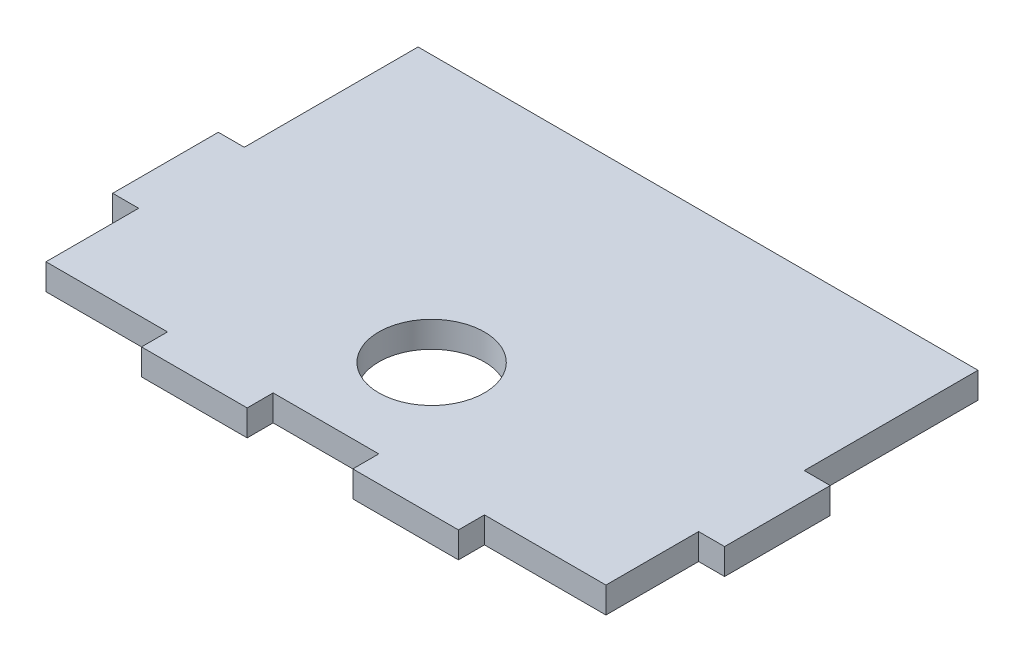
ISO-10303-21;
HEADER;
FILE_DESCRIPTION(('STEP AP214'),'2;1');
FILE_NAME('part.step','',(''),(''),'','','');
FILE_SCHEMA(('AUTOMOTIVE_DESIGN { 1 0 10303 214 1 1 1 1 }'));
ENDSEC;
DATA;
#1=APPLICATION_CONTEXT('core data for automotive mechanical design processes');
#2=APPLICATION_PROTOCOL_DEFINITION('international standard','automotive_design',2000,#1);
#3=PRODUCT_CONTEXT('',#1,'mechanical');
#4=PRODUCT('Part','Part','',(#3));
#5=PRODUCT_RELATED_PRODUCT_CATEGORY('part','',(#4));
#6=PRODUCT_DEFINITION_FORMATION('','',#4);
#7=PRODUCT_DEFINITION_CONTEXT('part definition',#1,'design');
#8=PRODUCT_DEFINITION('design','',#6,#7);
#9=PRODUCT_DEFINITION_SHAPE('','',#8);
#10=(LENGTH_UNIT() NAMED_UNIT(*) SI_UNIT(.MILLI.,.METRE.));
#11=(NAMED_UNIT(*) PLANE_ANGLE_UNIT() SI_UNIT($,.RADIAN.));
#12=(NAMED_UNIT(*) SI_UNIT($,.STERADIAN.) SOLID_ANGLE_UNIT());
#13=UNCERTAINTY_MEASURE_WITH_UNIT(LENGTH_MEASURE(1.E-05),#10,'distance_accuracy_value','');
#14=(GEOMETRIC_REPRESENTATION_CONTEXT(3) GLOBAL_UNCERTAINTY_ASSIGNED_CONTEXT((#13)) GLOBAL_UNIT_ASSIGNED_CONTEXT((#10,
#11,#12)) REPRESENTATION_CONTEXT('',''));
#15=CARTESIAN_POINT('',(0.,0.,0.));
#16=DIRECTION('',(0.,0.,1.));
#17=DIRECTION('',(1.,0.,0.));
#18=AXIS2_PLACEMENT_3D('',#15,#16,#17);
#19=CARTESIAN_POINT('',(0.,3.1242,0.));
#20=DIRECTION('',(0.,-1.,0.));
#21=DIRECTION('',(0.,0.,-1.));
#22=AXIS2_PLACEMENT_3D('',#19,#20,#21);
#23=PLANE('',#22);
#24=DIRECTION('',(0.,0.,-1.));
#25=VECTOR('',#24,1.);
#26=CARTESIAN_POINT('',(127.754742857143,3.1242,52.7558));
#27=LINE('',#26,#25);
#28=CARTESIAN_POINT('',(127.754742857143,3.1242,52.7558));
#29=VERTEX_POINT('',#28);
#30=CARTESIAN_POINT('',(127.754742857143,3.1242,49.6316));
#31=VERTEX_POINT('',#30);
#32=EDGE_CURVE('E241',#29,#31,#27,.T.);
#33=ORIENTED_EDGE('',*,*,#32,.T.);
#34=DIRECTION('',(1.,0.,0.));
#35=VECTOR('',#34,1.);
#36=CARTESIAN_POINT('',(127.754742857143,3.1242,49.6316));
#37=LINE('',#36,#35);
#38=CARTESIAN_POINT('',(140.454742857143,3.1242,49.6316));
#39=VERTEX_POINT('',#38);
#40=EDGE_CURVE('E129',#31,#39,#37,.T.);
#41=ORIENTED_EDGE('',*,*,#40,.T.);
#42=DIRECTION('',(0.,0.,1.));
#43=VECTOR('',#42,1.);
#44=CARTESIAN_POINT('',(140.454742857143,3.1242,49.6316));
#45=LINE('',#44,#43);
#46=CARTESIAN_POINT('',(140.454742857143,3.1242,52.7558));
#47=VERTEX_POINT('',#46);
#48=EDGE_CURVE('E292',#39,#47,#45,.T.);
#49=ORIENTED_EDGE('',*,*,#48,.T.);
#50=DIRECTION('',(1.,0.,0.));
#51=VECTOR('',#50,1.);
#52=CARTESIAN_POINT('',(140.454742857143,3.1242,52.7558));
#53=LINE('',#52,#51);
#54=CARTESIAN_POINT('',(153.154742857143,3.1242,52.7558));
#55=VERTEX_POINT('',#54);
#56=EDGE_CURVE('E311',#47,#55,#53,.T.);
#57=ORIENTED_EDGE('',*,*,#56,.T.);
#58=DIRECTION('',(0.,0.,-1.));
#59=VECTOR('',#58,1.);
#60=CARTESIAN_POINT('',(153.154742857143,3.1242,52.7558));
#61=LINE('',#60,#59);
#62=CARTESIAN_POINT('',(153.154742857143,3.1242,49.6316));
#63=VERTEX_POINT('',#62);
#64=EDGE_CURVE('E308',#55,#63,#61,.T.);
#65=ORIENTED_EDGE('',*,*,#64,.T.);
#66=DIRECTION('',(1.,0.,0.));
#67=VECTOR('',#66,1.);
#68=CARTESIAN_POINT('',(153.154742857143,3.1242,49.6316));
#69=LINE('',#68,#67);
#70=CARTESIAN_POINT('',(167.759742857143,3.1242,49.6316));
#71=VERTEX_POINT('',#70);
#72=EDGE_CURVE('E310',#63,#71,#69,.T.);
#73=ORIENTED_EDGE('',*,*,#72,.T.);
#74=DIRECTION('',(0.,0.,-1.));
#75=VECTOR('',#74,1.);
#76=CARTESIAN_POINT('',(167.759742857143,3.1242,49.6316));
#77=LINE('',#76,#75);
#78=CARTESIAN_POINT('',(167.759742857143,3.1242,38.4937));
#79=VERTEX_POINT('',#78);
#80=EDGE_CURVE('E313',#71,#79,#77,.T.);
#81=ORIENTED_EDGE('',*,*,#80,.T.);
#82=DIRECTION('',(1.,0.,0.));
#83=VECTOR('',#82,1.);
#84=CARTESIAN_POINT('',(167.759742857143,3.1242,38.4937));
#85=LINE('',#84,#83);
#86=CARTESIAN_POINT('',(170.883942857143,3.1242,38.4937));
#87=VERTEX_POINT('',#86);
#88=EDGE_CURVE('E319',#79,#87,#85,.T.);
#89=ORIENTED_EDGE('',*,*,#88,.T.);
#90=DIRECTION('',(0.,0.,-1.));
#91=VECTOR('',#90,1.);
#92=CARTESIAN_POINT('',(170.883942857143,3.1242,38.4937));
#93=LINE('',#92,#91);
#94=CARTESIAN_POINT('',(170.883942857143,3.1242,25.7937));
#95=VERTEX_POINT('',#94);
#96=EDGE_CURVE('E321',#87,#95,#93,.T.);
#97=ORIENTED_EDGE('',*,*,#96,.T.);
#98=DIRECTION('',(-1.,0.,0.));
#99=VECTOR('',#98,1.);
#100=CARTESIAN_POINT('',(170.883942857143,3.1242,25.7937));
#101=LINE('',#100,#99);
#102=CARTESIAN_POINT('',(167.759742857143,3.1242,25.7937));
#103=VERTEX_POINT('',#102);
#104=EDGE_CURVE('E323',#95,#103,#101,.T.);
#105=ORIENTED_EDGE('',*,*,#104,.T.);
#106=DIRECTION('',(0.,0.,-1.));
#107=VECTOR('',#106,1.);
#108=CARTESIAN_POINT('',(167.759742857143,3.1242,25.7937));
#109=LINE('',#108,#107);
#110=CARTESIAN_POINT('',(167.759742857143,3.1242,4.90713052192582));
#111=VERTEX_POINT('',#110);
#112=EDGE_CURVE('E325',#103,#111,#109,.T.);
#113=ORIENTED_EDGE('',*,*,#112,.T.);
#114=DIRECTION('',(-1.,0.,0.));
#115=VECTOR('',#114,1.);
#116=CARTESIAN_POINT('',(167.759742857143,3.1242,4.90713052192582));
#117=LINE('',#116,#115);
#118=CARTESIAN_POINT('',(100.449742857143,3.1242,4.90713052192583));
#119=VERTEX_POINT('',#118);
#120=EDGE_CURVE('E327',#111,#119,#117,.T.);
#121=ORIENTED_EDGE('',*,*,#120,.T.);
#122=DIRECTION('',(0.,0.,1.));
#123=VECTOR('',#122,1.);
#124=CARTESIAN_POINT('',(100.449742857143,3.1242,4.90713052192583));
#125=LINE('',#124,#123);
#126=CARTESIAN_POINT('',(100.449742857143,3.1242,25.7937));
#127=VERTEX_POINT('',#126);
#128=EDGE_CURVE('E329',#119,#127,#125,.T.);
#129=ORIENTED_EDGE('',*,*,#128,.T.);
#130=DIRECTION('',(-1.,0.,0.));
#131=VECTOR('',#130,1.);
#132=CARTESIAN_POINT('',(100.449742857143,3.1242,25.7937));
#133=LINE('',#132,#131);
#134=CARTESIAN_POINT('',(97.3255428571429,3.1242,25.7937));
#135=VERTEX_POINT('',#134);
#136=EDGE_CURVE('E331',#127,#135,#133,.T.);
#137=ORIENTED_EDGE('',*,*,#136,.T.);
#138=DIRECTION('',(0.,0.,1.));
#139=VECTOR('',#138,1.);
#140=CARTESIAN_POINT('',(97.3255428571429,3.1242,25.7937));
#141=LINE('',#140,#139);
#142=CARTESIAN_POINT('',(97.3255428571429,3.1242,38.4937));
#143=VERTEX_POINT('',#142);
#144=EDGE_CURVE('E333',#135,#143,#141,.T.);
#145=ORIENTED_EDGE('',*,*,#144,.T.);
#146=DIRECTION('',(1.,0.,0.));
#147=VECTOR('',#146,1.);
#148=CARTESIAN_POINT('',(97.3255428571429,3.1242,38.4937));
#149=LINE('',#148,#147);
#150=CARTESIAN_POINT('',(100.449742857143,3.1242,38.4937));
#151=VERTEX_POINT('',#150);
#152=EDGE_CURVE('E335',#143,#151,#149,.T.);
#153=ORIENTED_EDGE('',*,*,#152,.T.);
#154=DIRECTION('',(0.,0.,1.));
#155=VECTOR('',#154,1.);
#156=CARTESIAN_POINT('',(100.449742857143,3.1242,38.4937));
#157=LINE('',#156,#155);
#158=CARTESIAN_POINT('',(100.449742857143,3.1242,49.6316));
#159=VERTEX_POINT('',#158);
#160=EDGE_CURVE('E184',#151,#159,#157,.T.);
#161=ORIENTED_EDGE('',*,*,#160,.T.);
#162=DIRECTION('',(1.,0.,0.));
#163=VECTOR('',#162,1.);
#164=CARTESIAN_POINT('',(100.449742857143,3.1242,49.6316));
#165=LINE('',#164,#163);
#166=CARTESIAN_POINT('',(115.054742857143,3.1242,49.6316));
#167=VERTEX_POINT('',#166);
#168=EDGE_CURVE('E178',#159,#167,#165,.T.);
#169=ORIENTED_EDGE('',*,*,#168,.T.);
#170=DIRECTION('',(0.,0.,1.));
#171=VECTOR('',#170,1.);
#172=CARTESIAN_POINT('',(115.054742857143,3.1242,49.6316));
#173=LINE('',#172,#171);
#174=CARTESIAN_POINT('',(115.054742857143,3.1242,52.7558));
#175=VERTEX_POINT('',#174);
#176=EDGE_CURVE('E182',#167,#175,#173,.T.);
#177=ORIENTED_EDGE('',*,*,#176,.T.);
#178=DIRECTION('',(1.,0.,0.));
#179=VECTOR('',#178,1.);
#180=CARTESIAN_POINT('',(115.054742857143,3.1242,52.7558));
#181=LINE('',#180,#179);
#182=EDGE_CURVE('E50',#175,#29,#181,.T.);
#183=ORIENTED_EDGE('',*,*,#182,.T.);
#184=EDGE_LOOP('',(#33,#41,#49,#57,#65,#73,#81,#89,#97,#105,#113,#121,#129,#137,#145,#153,#161,
#169,#177,#183));
#185=FACE_BOUND('',#184,.T.);
#186=CARTESIAN_POINT('',(134.104742857143,3.1242,36.9316));
#187=DIRECTION('',(0.,1.,0.));
#188=DIRECTION('',(0.,0.,1.));
#189=AXIS2_PLACEMENT_3D('',#186,#187,#188);
#190=CIRCLE('',#189,6.35);
#191=CARTESIAN_POINT('',(134.104742857143,3.1242,43.2816));
#192=VERTEX_POINT('',#191);
#193=EDGE_CURVE('E206',#192,#192,#190,.T.);
#194=ORIENTED_EDGE('',*,*,#193,.F.);
#195=EDGE_LOOP('',(#194));
#196=FACE_BOUND('',#195,.T.);
#197=ADVANCED_FACE('F33',(#185,#196),#23,.F.);
#198=CARTESIAN_POINT('',(0.,0.,0.));
#199=DIRECTION('',(0.,-1.,0.));
#200=DIRECTION('',(0.,0.,-1.));
#201=AXIS2_PLACEMENT_3D('',#198,#199,#200);
#202=PLANE('',#201);
#203=DIRECTION('',(0.,0.,-1.));
#204=VECTOR('',#203,1.);
#205=CARTESIAN_POINT('',(127.754742857143,0.,52.7558));
#206=LINE('',#205,#204);
#207=CARTESIAN_POINT('',(127.754742857143,0.,52.7558));
#208=VERTEX_POINT('',#207);
#209=CARTESIAN_POINT('',(127.754742857143,0.,49.6316));
#210=VERTEX_POINT('',#209);
#211=EDGE_CURVE('E202',#208,#210,#206,.T.);
#212=ORIENTED_EDGE('',*,*,#211,.F.);
#213=DIRECTION('',(1.,0.,0.));
#214=VECTOR('',#213,1.);
#215=CARTESIAN_POINT('',(115.054742857143,0.,52.7558));
#216=LINE('',#215,#214);
#217=CARTESIAN_POINT('',(115.054742857143,0.,52.7558));
#218=VERTEX_POINT('',#217);
#219=EDGE_CURVE('E121',#218,#208,#216,.T.);
#220=ORIENTED_EDGE('',*,*,#219,.F.);
#221=DIRECTION('',(0.,0.,1.));
#222=VECTOR('',#221,1.);
#223=CARTESIAN_POINT('',(115.054742857143,0.,49.6316));
#224=LINE('',#223,#222);
#225=CARTESIAN_POINT('',(115.054742857143,0.,49.6316));
#226=VERTEX_POINT('',#225);
#227=EDGE_CURVE('E115',#226,#218,#224,.T.);
#228=ORIENTED_EDGE('',*,*,#227,.F.);
#229=DIRECTION('',(1.,0.,0.));
#230=VECTOR('',#229,1.);
#231=CARTESIAN_POINT('',(100.449742857143,0.,49.6316));
#232=LINE('',#231,#230);
#233=CARTESIAN_POINT('',(100.449742857143,0.,49.6316));
#234=VERTEX_POINT('',#233);
#235=EDGE_CURVE('E192',#234,#226,#232,.T.);
#236=ORIENTED_EDGE('',*,*,#235,.F.);
#237=DIRECTION('',(0.,0.,1.));
#238=VECTOR('',#237,1.);
#239=CARTESIAN_POINT('',(100.449742857143,0.,38.4937));
#240=LINE('',#239,#238);
#241=CARTESIAN_POINT('',(100.449742857143,0.,38.4937));
#242=VERTEX_POINT('',#241);
#243=EDGE_CURVE('E236',#242,#234,#240,.T.);
#244=ORIENTED_EDGE('',*,*,#243,.F.);
#245=DIRECTION('',(1.,0.,0.));
#246=VECTOR('',#245,1.);
#247=CARTESIAN_POINT('',(97.3255428571429,0.,38.4937));
#248=LINE('',#247,#246);
#249=CARTESIAN_POINT('',(97.3255428571429,0.,38.4937));
#250=VERTEX_POINT('',#249);
#251=EDGE_CURVE('E234',#250,#242,#248,.T.);
#252=ORIENTED_EDGE('',*,*,#251,.F.);
#253=DIRECTION('',(0.,0.,1.));
#254=VECTOR('',#253,1.);
#255=CARTESIAN_POINT('',(97.3255428571429,0.,25.7937));
#256=LINE('',#255,#254);
#257=CARTESIAN_POINT('',(97.3255428571429,0.,25.7937));
#258=VERTEX_POINT('',#257);
#259=EDGE_CURVE('E232',#258,#250,#256,.T.);
#260=ORIENTED_EDGE('',*,*,#259,.F.);
#261=DIRECTION('',(-1.,0.,0.));
#262=VECTOR('',#261,1.);
#263=CARTESIAN_POINT('',(100.449742857143,0.,25.7937));
#264=LINE('',#263,#262);
#265=CARTESIAN_POINT('',(100.449742857143,0.,25.7937));
#266=VERTEX_POINT('',#265);
#267=EDGE_CURVE('E230',#266,#258,#264,.T.);
#268=ORIENTED_EDGE('',*,*,#267,.F.);
#269=DIRECTION('',(0.,0.,1.));
#270=VECTOR('',#269,1.);
#271=CARTESIAN_POINT('',(100.449742857143,0.,4.90713052192583));
#272=LINE('',#271,#270);
#273=CARTESIAN_POINT('',(100.449742857143,0.,4.90713052192583));
#274=VERTEX_POINT('',#273);
#275=EDGE_CURVE('E228',#274,#266,#272,.T.);
#276=ORIENTED_EDGE('',*,*,#275,.F.);
#277=DIRECTION('',(-1.,0.,0.));
#278=VECTOR('',#277,1.);
#279=CARTESIAN_POINT('',(167.759742857143,0.,4.90713052192582));
#280=LINE('',#279,#278);
#281=CARTESIAN_POINT('',(167.759742857143,0.,4.90713052192582));
#282=VERTEX_POINT('',#281);
#283=EDGE_CURVE('E226',#282,#274,#280,.T.);
#284=ORIENTED_EDGE('',*,*,#283,.F.);
#285=DIRECTION('',(0.,0.,-1.));
#286=VECTOR('',#285,1.);
#287=CARTESIAN_POINT('',(167.759742857143,0.,25.7937));
#288=LINE('',#287,#286);
#289=CARTESIAN_POINT('',(167.759742857143,0.,25.7937));
#290=VERTEX_POINT('',#289);
#291=EDGE_CURVE('E224',#290,#282,#288,.T.);
#292=ORIENTED_EDGE('',*,*,#291,.F.);
#293=DIRECTION('',(-1.,0.,0.));
#294=VECTOR('',#293,1.);
#295=CARTESIAN_POINT('',(170.883942857143,0.,25.7937));
#296=LINE('',#295,#294);
#297=CARTESIAN_POINT('',(170.883942857143,0.,25.7937));
#298=VERTEX_POINT('',#297);
#299=EDGE_CURVE('E222',#298,#290,#296,.T.);
#300=ORIENTED_EDGE('',*,*,#299,.F.);
#301=DIRECTION('',(0.,0.,-1.));
#302=VECTOR('',#301,1.);
#303=CARTESIAN_POINT('',(170.883942857143,0.,38.4937));
#304=LINE('',#303,#302);
#305=CARTESIAN_POINT('',(170.883942857143,0.,38.4937));
#306=VERTEX_POINT('',#305);
#307=EDGE_CURVE('E220',#306,#298,#304,.T.);
#308=ORIENTED_EDGE('',*,*,#307,.F.);
#309=DIRECTION('',(1.,0.,0.));
#310=VECTOR('',#309,1.);
#311=CARTESIAN_POINT('',(167.759742857143,0.,38.4937));
#312=LINE('',#311,#310);
#313=CARTESIAN_POINT('',(167.759742857143,0.,38.4937));
#314=VERTEX_POINT('',#313);
#315=EDGE_CURVE('E218',#314,#306,#312,.T.);
#316=ORIENTED_EDGE('',*,*,#315,.F.);
#317=DIRECTION('',(0.,0.,-1.));
#318=VECTOR('',#317,1.);
#319=CARTESIAN_POINT('',(167.759742857143,0.,49.6316));
#320=LINE('',#319,#318);
#321=CARTESIAN_POINT('',(167.759742857143,0.,49.6316));
#322=VERTEX_POINT('',#321);
#323=EDGE_CURVE('E216',#322,#314,#320,.T.);
#324=ORIENTED_EDGE('',*,*,#323,.F.);
#325=DIRECTION('',(1.,0.,0.));
#326=VECTOR('',#325,1.);
#327=CARTESIAN_POINT('',(153.154742857143,0.,49.6316));
#328=LINE('',#327,#326);
#329=CARTESIAN_POINT('',(153.154742857143,0.,49.6316));
#330=VERTEX_POINT('',#329);
#331=EDGE_CURVE('E214',#330,#322,#328,.T.);
#332=ORIENTED_EDGE('',*,*,#331,.F.);
#333=DIRECTION('',(0.,0.,-1.));
#334=VECTOR('',#333,1.);
#335=CARTESIAN_POINT('',(153.154742857143,0.,52.7558));
#336=LINE('',#335,#334);
#337=CARTESIAN_POINT('',(153.154742857143,0.,52.7558));
#338=VERTEX_POINT('',#337);
#339=EDGE_CURVE('E212',#338,#330,#336,.T.);
#340=ORIENTED_EDGE('',*,*,#339,.F.);
#341=DIRECTION('',(1.,0.,0.));
#342=VECTOR('',#341,1.);
#343=CARTESIAN_POINT('',(140.454742857143,0.,52.7558));
#344=LINE('',#343,#342);
#345=CARTESIAN_POINT('',(140.454742857143,0.,52.7558));
#346=VERTEX_POINT('',#345);
#347=EDGE_CURVE('E210',#346,#338,#344,.T.);
#348=ORIENTED_EDGE('',*,*,#347,.F.);
#349=DIRECTION('',(0.,0.,1.));
#350=VECTOR('',#349,1.);
#351=CARTESIAN_POINT('',(140.454742857143,0.,49.6316));
#352=LINE('',#351,#350);
#353=CARTESIAN_POINT('',(140.454742857143,0.,49.6316));
#354=VERTEX_POINT('',#353);
#355=EDGE_CURVE('E208',#354,#346,#352,.T.);
#356=ORIENTED_EDGE('',*,*,#355,.F.);
#357=DIRECTION('',(1.,0.,0.));
#358=VECTOR('',#357,1.);
#359=CARTESIAN_POINT('',(127.754742857143,0.,49.6316));
#360=LINE('',#359,#358);
#361=EDGE_CURVE('E205',#210,#354,#360,.T.);
#362=ORIENTED_EDGE('',*,*,#361,.F.);
#363=EDGE_LOOP('',(#212,#220,#228,#236,#244,#252,#260,#268,#276,#284,#292,#300,#308,#316,#324,
#332,#340,#348,#356,#362));
#364=FACE_BOUND('',#363,.T.);
#365=CARTESIAN_POINT('',(134.104742857143,0.,36.9316));
#366=DIRECTION('',(0.,1.,0.));
#367=DIRECTION('',(0.,0.,1.));
#368=AXIS2_PLACEMENT_3D('',#365,#366,#367);
#369=CIRCLE('',#368,6.35);
#370=CARTESIAN_POINT('',(134.104742857143,0.,43.2816));
#371=VERTEX_POINT('',#370);
#372=EDGE_CURVE('E586',#371,#371,#369,.T.);
#373=ORIENTED_EDGE('',*,*,#372,.T.);
#374=EDGE_LOOP('',(#373));
#375=FACE_BOUND('',#374,.T.);
#376=ADVANCED_FACE('F296',(#364,#375),#202,.T.);
#377=CARTESIAN_POINT('',(127.754742857143,3.1242,52.7558));
#378=DIRECTION('',(-1.,0.,0.));
#379=DIRECTION('',(0.,0.,1.));
#380=AXIS2_PLACEMENT_3D('',#377,#378,#379);
#381=PLANE('',#380);
#382=ORIENTED_EDGE('',*,*,#211,.T.);
#383=DIRECTION('',(0.,-1.,0.));
#384=VECTOR('',#383,1.);
#385=CARTESIAN_POINT('',(127.754742857143,3.1242,49.6316));
#386=LINE('',#385,#384);
#387=EDGE_CURVE('E11',#31,#210,#386,.T.);
#388=ORIENTED_EDGE('',*,*,#387,.F.);
#389=ORIENTED_EDGE('',*,*,#32,.F.);
#390=DIRECTION('',(0.,-1.,0.));
#391=VECTOR('',#390,1.);
#392=CARTESIAN_POINT('',(127.754742857143,3.1242,52.7558));
#393=LINE('',#392,#391);
#394=EDGE_CURVE('E198',#29,#208,#393,.T.);
#395=ORIENTED_EDGE('',*,*,#394,.T.);
#396=EDGE_LOOP('',(#382,#388,#389,#395));
#397=FACE_BOUND('',#396,.T.);
#398=ADVANCED_FACE('F35',(#397),#381,.F.);
#399=CARTESIAN_POINT('',(127.754742857143,3.1242,49.6316));
#400=DIRECTION('',(0.,0.,-1.));
#401=DIRECTION('',(-1.,0.,0.));
#402=AXIS2_PLACEMENT_3D('',#399,#400,#401);
#403=PLANE('',#402);
#404=ORIENTED_EDGE('',*,*,#361,.T.);
#405=DIRECTION('',(0.,-1.,0.));
#406=VECTOR('',#405,1.);
#407=CARTESIAN_POINT('',(140.454742857143,3.1242,49.6316));
#408=LINE('',#407,#406);
#409=EDGE_CURVE('E42',#39,#354,#408,.T.);
#410=ORIENTED_EDGE('',*,*,#409,.F.);
#411=ORIENTED_EDGE('',*,*,#40,.F.);
#412=ORIENTED_EDGE('',*,*,#387,.T.);
#413=EDGE_LOOP('',(#404,#410,#411,#412));
#414=FACE_BOUND('',#413,.T.);
#415=ADVANCED_FACE('F369',(#414),#403,.F.);
#416=CARTESIAN_POINT('',(140.454742857143,3.1242,49.6316));
#417=DIRECTION('',(1.,0.,0.));
#418=DIRECTION('',(0.,0.,-1.));
#419=AXIS2_PLACEMENT_3D('',#416,#417,#418);
#420=PLANE('',#419);
#421=ORIENTED_EDGE('',*,*,#355,.T.);
#422=DIRECTION('',(0.,-1.,0.));
#423=VECTOR('',#422,1.);
#424=CARTESIAN_POINT('',(140.454742857143,3.1242,52.7558));
#425=LINE('',#424,#423);
#426=EDGE_CURVE('E284',#47,#346,#425,.T.);
#427=ORIENTED_EDGE('',*,*,#426,.F.);
#428=ORIENTED_EDGE('',*,*,#48,.F.);
#429=ORIENTED_EDGE('',*,*,#409,.T.);
#430=EDGE_LOOP('',(#421,#427,#428,#429));
#431=FACE_BOUND('',#430,.T.);
#432=ADVANCED_FACE('F290',(#431),#420,.F.);
#433=CARTESIAN_POINT('',(140.454742857143,3.1242,52.7558));
#434=DIRECTION('',(0.,0.,-1.));
#435=DIRECTION('',(-1.,0.,0.));
#436=AXIS2_PLACEMENT_3D('',#433,#434,#435);
#437=PLANE('',#436);
#438=ORIENTED_EDGE('',*,*,#347,.T.);
#439=DIRECTION('',(0.,-1.,0.));
#440=VECTOR('',#439,1.);
#441=CARTESIAN_POINT('',(153.154742857143,3.1242,52.7558));
#442=LINE('',#441,#440);
#443=EDGE_CURVE('E281',#55,#338,#442,.T.);
#444=ORIENTED_EDGE('',*,*,#443,.F.);
#445=ORIENTED_EDGE('',*,*,#56,.F.);
#446=ORIENTED_EDGE('',*,*,#426,.T.);
#447=EDGE_LOOP('',(#438,#444,#445,#446));
#448=FACE_BOUND('',#447,.T.);
#449=ADVANCED_FACE('F302',(#448),#437,.F.);
#450=CARTESIAN_POINT('',(153.154742857143,3.1242,52.7558));
#451=DIRECTION('',(-1.,0.,0.));
#452=DIRECTION('',(0.,0.,1.));
#453=AXIS2_PLACEMENT_3D('',#450,#451,#452);
#454=PLANE('',#453);
#455=ORIENTED_EDGE('',*,*,#339,.T.);
#456=DIRECTION('',(0.,-1.,0.));
#457=VECTOR('',#456,1.);
#458=CARTESIAN_POINT('',(153.154742857143,3.1242,49.6316));
#459=LINE('',#458,#457);
#460=EDGE_CURVE('E278',#63,#330,#459,.T.);
#461=ORIENTED_EDGE('',*,*,#460,.F.);
#462=ORIENTED_EDGE('',*,*,#64,.F.);
#463=ORIENTED_EDGE('',*,*,#443,.T.);
#464=EDGE_LOOP('',(#455,#461,#462,#463));
#465=FACE_BOUND('',#464,.T.);
#466=ADVANCED_FACE('F306',(#465),#454,.F.);
#467=CARTESIAN_POINT('',(153.154742857143,3.1242,49.6316));
#468=DIRECTION('',(0.,0.,-1.));
#469=DIRECTION('',(-1.,0.,0.));
#470=AXIS2_PLACEMENT_3D('',#467,#468,#469);
#471=PLANE('',#470);
#472=ORIENTED_EDGE('',*,*,#331,.T.);
#473=DIRECTION('',(0.,-1.,0.));
#474=VECTOR('',#473,1.);
#475=CARTESIAN_POINT('',(167.759742857143,3.1242,49.6316));
#476=LINE('',#475,#474);
#477=EDGE_CURVE('E275',#71,#322,#476,.T.);
#478=ORIENTED_EDGE('',*,*,#477,.F.);
#479=ORIENTED_EDGE('',*,*,#72,.F.);
#480=ORIENTED_EDGE('',*,*,#460,.T.);
#481=EDGE_LOOP('',(#472,#478,#479,#480));
#482=FACE_BOUND('',#481,.T.);
#483=ADVANCED_FACE('F382',(#482),#471,.F.);
#484=CARTESIAN_POINT('',(167.759742857143,3.1242,49.6316));
#485=DIRECTION('',(-1.,0.,0.));
#486=DIRECTION('',(0.,0.,1.));
#487=AXIS2_PLACEMENT_3D('',#484,#485,#486);
#488=PLANE('',#487);
#489=ORIENTED_EDGE('',*,*,#323,.T.);
#490=DIRECTION('',(0.,-1.,0.));
#491=VECTOR('',#490,1.);
#492=CARTESIAN_POINT('',(167.759742857143,3.1242,38.4937));
#493=LINE('',#492,#491);
#494=EDGE_CURVE('E272',#79,#314,#493,.T.);
#495=ORIENTED_EDGE('',*,*,#494,.F.);
#496=ORIENTED_EDGE('',*,*,#80,.F.);
#497=ORIENTED_EDGE('',*,*,#477,.T.);
#498=EDGE_LOOP('',(#489,#495,#496,#497));
#499=FACE_BOUND('',#498,.T.);
#500=ADVANCED_FACE('F385',(#499),#488,.F.);
#501=CARTESIAN_POINT('',(167.759742857143,3.1242,38.4937));
#502=DIRECTION('',(0.,0.,-1.));
#503=DIRECTION('',(-1.,0.,0.));
#504=AXIS2_PLACEMENT_3D('',#501,#502,#503);
#505=PLANE('',#504);
#506=ORIENTED_EDGE('',*,*,#315,.T.);
#507=DIRECTION('',(0.,-1.,0.));
#508=VECTOR('',#507,1.);
#509=CARTESIAN_POINT('',(170.883942857143,3.1242,38.4937));
#510=LINE('',#509,#508);
#511=EDGE_CURVE('E269',#87,#306,#510,.T.);
#512=ORIENTED_EDGE('',*,*,#511,.F.);
#513=ORIENTED_EDGE('',*,*,#88,.F.);
#514=ORIENTED_EDGE('',*,*,#494,.T.);
#515=EDGE_LOOP('',(#506,#512,#513,#514));
#516=FACE_BOUND('',#515,.T.);
#517=ADVANCED_FACE('F389',(#516),#505,.F.);
#518=CARTESIAN_POINT('',(170.883942857143,3.1242,38.4937));
#519=DIRECTION('',(-1.,0.,0.));
#520=DIRECTION('',(0.,0.,1.));
#521=AXIS2_PLACEMENT_3D('',#518,#519,#520);
#522=PLANE('',#521);
#523=ORIENTED_EDGE('',*,*,#307,.T.);
#524=DIRECTION('',(0.,-1.,0.));
#525=VECTOR('',#524,1.);
#526=CARTESIAN_POINT('',(170.883942857143,3.1242,25.7937));
#527=LINE('',#526,#525);
#528=EDGE_CURVE('E266',#95,#298,#527,.T.);
#529=ORIENTED_EDGE('',*,*,#528,.F.);
#530=ORIENTED_EDGE('',*,*,#96,.F.);
#531=ORIENTED_EDGE('',*,*,#511,.T.);
#532=EDGE_LOOP('',(#523,#529,#530,#531));
#533=FACE_BOUND('',#532,.T.);
#534=ADVANCED_FACE('F393',(#533),#522,.F.);
#535=CARTESIAN_POINT('',(170.883942857143,3.1242,25.7937));
#536=DIRECTION('',(0.,0.,1.));
#537=DIRECTION('',(1.,0.,0.));
#538=AXIS2_PLACEMENT_3D('',#535,#536,#537);
#539=PLANE('',#538);
#540=ORIENTED_EDGE('',*,*,#299,.T.);
#541=DIRECTION('',(0.,-1.,0.));
#542=VECTOR('',#541,1.);
#543=CARTESIAN_POINT('',(167.759742857143,3.1242,25.7937));
#544=LINE('',#543,#542);
#545=EDGE_CURVE('E263',#103,#290,#544,.T.);
#546=ORIENTED_EDGE('',*,*,#545,.F.);
#547=ORIENTED_EDGE('',*,*,#104,.F.);
#548=ORIENTED_EDGE('',*,*,#528,.T.);
#549=EDGE_LOOP('',(#540,#546,#547,#548));
#550=FACE_BOUND('',#549,.T.);
#551=ADVANCED_FACE('F397',(#550),#539,.F.);
#552=CARTESIAN_POINT('',(167.759742857143,3.1242,25.7937));
#553=DIRECTION('',(-1.,0.,0.));
#554=DIRECTION('',(0.,0.,1.));
#555=AXIS2_PLACEMENT_3D('',#552,#553,#554);
#556=PLANE('',#555);
#557=ORIENTED_EDGE('',*,*,#291,.T.);
#558=DIRECTION('',(0.,-1.,0.));
#559=VECTOR('',#558,1.);
#560=CARTESIAN_POINT('',(167.759742857143,3.1242,4.90713052192582));
#561=LINE('',#560,#559);
#562=EDGE_CURVE('E260',#111,#282,#561,.T.);
#563=ORIENTED_EDGE('',*,*,#562,.F.);
#564=ORIENTED_EDGE('',*,*,#112,.F.);
#565=ORIENTED_EDGE('',*,*,#545,.T.);
#566=EDGE_LOOP('',(#557,#563,#564,#565));
#567=FACE_BOUND('',#566,.T.);
#568=ADVANCED_FACE('F401',(#567),#556,.F.);
#569=CARTESIAN_POINT('',(167.759742857143,3.1242,4.90713052192582));
#570=DIRECTION('',(0.,0.,1.));
#571=DIRECTION('',(1.,0.,0.));
#572=AXIS2_PLACEMENT_3D('',#569,#570,#571);
#573=PLANE('',#572);
#574=ORIENTED_EDGE('',*,*,#283,.T.);
#575=DIRECTION('',(0.,-1.,0.));
#576=VECTOR('',#575,1.);
#577=CARTESIAN_POINT('',(100.449742857143,3.1242,4.90713052192583));
#578=LINE('',#577,#576);
#579=EDGE_CURVE('E257',#119,#274,#578,.T.);
#580=ORIENTED_EDGE('',*,*,#579,.F.);
#581=ORIENTED_EDGE('',*,*,#120,.F.);
#582=ORIENTED_EDGE('',*,*,#562,.T.);
#583=EDGE_LOOP('',(#574,#580,#581,#582));
#584=FACE_BOUND('',#583,.T.);
#585=ADVANCED_FACE('F405',(#584),#573,.F.);
#586=CARTESIAN_POINT('',(100.449742857143,3.1242,4.90713052192583));
#587=DIRECTION('',(1.,0.,0.));
#588=DIRECTION('',(0.,0.,-1.));
#589=AXIS2_PLACEMENT_3D('',#586,#587,#588);
#590=PLANE('',#589);
#591=ORIENTED_EDGE('',*,*,#275,.T.);
#592=DIRECTION('',(0.,-1.,0.));
#593=VECTOR('',#592,1.);
#594=CARTESIAN_POINT('',(100.449742857143,3.1242,25.7937));
#595=LINE('',#594,#593);
#596=EDGE_CURVE('E254',#127,#266,#595,.T.);
#597=ORIENTED_EDGE('',*,*,#596,.F.);
#598=ORIENTED_EDGE('',*,*,#128,.F.);
#599=ORIENTED_EDGE('',*,*,#579,.T.);
#600=EDGE_LOOP('',(#591,#597,#598,#599));
#601=FACE_BOUND('',#600,.T.);
#602=ADVANCED_FACE('F409',(#601),#590,.F.);
#603=CARTESIAN_POINT('',(100.449742857143,3.1242,25.7937));
#604=DIRECTION('',(0.,0.,1.));
#605=DIRECTION('',(1.,0.,0.));
#606=AXIS2_PLACEMENT_3D('',#603,#604,#605);
#607=PLANE('',#606);
#608=ORIENTED_EDGE('',*,*,#267,.T.);
#609=DIRECTION('',(0.,-1.,0.));
#610=VECTOR('',#609,1.);
#611=CARTESIAN_POINT('',(97.3255428571429,3.1242,25.7937));
#612=LINE('',#611,#610);
#613=EDGE_CURVE('E251',#135,#258,#612,.T.);
#614=ORIENTED_EDGE('',*,*,#613,.F.);
#615=ORIENTED_EDGE('',*,*,#136,.F.);
#616=ORIENTED_EDGE('',*,*,#596,.T.);
#617=EDGE_LOOP('',(#608,#614,#615,#616));
#618=FACE_BOUND('',#617,.T.);
#619=ADVANCED_FACE('F413',(#618),#607,.F.);
#620=CARTESIAN_POINT('',(97.3255428571429,3.1242,25.7937));
#621=DIRECTION('',(1.,0.,0.));
#622=DIRECTION('',(0.,0.,-1.));
#623=AXIS2_PLACEMENT_3D('',#620,#621,#622);
#624=PLANE('',#623);
#625=ORIENTED_EDGE('',*,*,#259,.T.);
#626=DIRECTION('',(0.,-1.,0.));
#627=VECTOR('',#626,1.);
#628=CARTESIAN_POINT('',(97.3255428571429,3.1242,38.4937));
#629=LINE('',#628,#627);
#630=EDGE_CURVE('E248',#143,#250,#629,.T.);
#631=ORIENTED_EDGE('',*,*,#630,.F.);
#632=ORIENTED_EDGE('',*,*,#144,.F.);
#633=ORIENTED_EDGE('',*,*,#613,.T.);
#634=EDGE_LOOP('',(#625,#631,#632,#633));
#635=FACE_BOUND('',#634,.T.);
#636=ADVANCED_FACE('F417',(#635),#624,.F.);
#637=CARTESIAN_POINT('',(97.3255428571429,3.1242,38.4937));
#638=DIRECTION('',(0.,0.,-1.));
#639=DIRECTION('',(-1.,0.,0.));
#640=AXIS2_PLACEMENT_3D('',#637,#638,#639);
#641=PLANE('',#640);
#642=ORIENTED_EDGE('',*,*,#251,.T.);
#643=DIRECTION('',(0.,-1.,0.));
#644=VECTOR('',#643,1.);
#645=CARTESIAN_POINT('',(100.449742857143,3.1242,38.4937));
#646=LINE('',#645,#644);
#647=EDGE_CURVE('E245',#151,#242,#646,.T.);
#648=ORIENTED_EDGE('',*,*,#647,.F.);
#649=ORIENTED_EDGE('',*,*,#152,.F.);
#650=ORIENTED_EDGE('',*,*,#630,.T.);
#651=EDGE_LOOP('',(#642,#648,#649,#650));
#652=FACE_BOUND('',#651,.T.);
#653=ADVANCED_FACE('F341',(#652),#641,.F.);
#654=CARTESIAN_POINT('',(100.449742857143,3.1242,38.4937));
#655=DIRECTION('',(1.,0.,0.));
#656=DIRECTION('',(0.,0.,-1.));
#657=AXIS2_PLACEMENT_3D('',#654,#655,#656);
#658=PLANE('',#657);
#659=ORIENTED_EDGE('',*,*,#243,.T.);
#660=DIRECTION('',(0.,-1.,0.));
#661=VECTOR('',#660,1.);
#662=CARTESIAN_POINT('',(100.449742857143,3.1242,49.6316));
#663=LINE('',#662,#661);
#664=EDGE_CURVE('E193',#159,#234,#663,.T.);
#665=ORIENTED_EDGE('',*,*,#664,.F.);
#666=ORIENTED_EDGE('',*,*,#160,.F.);
#667=ORIENTED_EDGE('',*,*,#647,.T.);
#668=EDGE_LOOP('',(#659,#665,#666,#667));
#669=FACE_BOUND('',#668,.T.);
#670=ADVANCED_FACE('F345',(#669),#658,.F.);
#671=CARTESIAN_POINT('',(100.449742857143,3.1242,49.6316));
#672=DIRECTION('',(0.,0.,-1.));
#673=DIRECTION('',(-1.,0.,0.));
#674=AXIS2_PLACEMENT_3D('',#671,#672,#673);
#675=PLANE('',#674);
#676=ORIENTED_EDGE('',*,*,#235,.T.);
#677=DIRECTION('',(0.,-1.,0.));
#678=VECTOR('',#677,1.);
#679=CARTESIAN_POINT('',(115.054742857143,3.1242,49.6316));
#680=LINE('',#679,#678);
#681=EDGE_CURVE('E189',#167,#226,#680,.T.);
#682=ORIENTED_EDGE('',*,*,#681,.F.);
#683=ORIENTED_EDGE('',*,*,#168,.F.);
#684=ORIENTED_EDGE('',*,*,#664,.T.);
#685=EDGE_LOOP('',(#676,#682,#683,#684));
#686=FACE_BOUND('',#685,.T.);
#687=ADVANCED_FACE('F190',(#686),#675,.F.);
#688=CARTESIAN_POINT('',(115.054742857143,3.1242,49.6316));
#689=DIRECTION('',(1.,0.,0.));
#690=DIRECTION('',(0.,0.,-1.));
#691=AXIS2_PLACEMENT_3D('',#688,#689,#690);
#692=PLANE('',#691);
#693=ORIENTED_EDGE('',*,*,#227,.T.);
#694=DIRECTION('',(0.,-1.,0.));
#695=VECTOR('',#694,1.);
#696=CARTESIAN_POINT('',(115.054742857143,3.1242,52.7558));
#697=LINE('',#696,#695);
#698=EDGE_CURVE('E194',#175,#218,#697,.T.);
#699=ORIENTED_EDGE('',*,*,#698,.F.);
#700=ORIENTED_EDGE('',*,*,#176,.F.);
#701=ORIENTED_EDGE('',*,*,#681,.T.);
#702=EDGE_LOOP('',(#693,#699,#700,#701));
#703=FACE_BOUND('',#702,.T.);
#704=ADVANCED_FACE('F196',(#703),#692,.F.);
#705=CARTESIAN_POINT('',(115.054742857143,3.1242,52.7558));
#706=DIRECTION('',(0.,0.,-1.));
#707=DIRECTION('',(-1.,0.,0.));
#708=AXIS2_PLACEMENT_3D('',#705,#706,#707);
#709=PLANE('',#708);
#710=ORIENTED_EDGE('',*,*,#219,.T.);
#711=ORIENTED_EDGE('',*,*,#394,.F.);
#712=ORIENTED_EDGE('',*,*,#182,.F.);
#713=ORIENTED_EDGE('',*,*,#698,.T.);
#714=EDGE_LOOP('',(#710,#711,#712,#713));
#715=FACE_BOUND('',#714,.T.);
#716=ADVANCED_FACE('F349',(#715),#709,.F.);
#717=CARTESIAN_POINT('',(134.104742857143,3.1242,36.9316));
#718=DIRECTION('',(0.,-1.,0.));
#719=DIRECTION('',(0.,0.,-1.));
#720=AXIS2_PLACEMENT_3D('',#717,#718,#719);
#721=CYLINDRICAL_SURFACE('',#720,6.35);
#722=ORIENTED_EDGE('',*,*,#193,.T.);
#723=EDGE_LOOP('',(#722));
#724=FACE_BOUND('',#723,.T.);
#725=ORIENTED_EDGE('',*,*,#372,.F.);
#726=EDGE_LOOP('',(#725));
#727=FACE_BOUND('',#726,.T.);
#728=ADVANCED_FACE('F351',(#724,#727),#721,.F.);
#729=CLOSED_SHELL('',(#197,#376,#398,#415,#432,#449,#466,#483,#500,#517,#534,#551,#568,#585,
#602,#619,#636,#653,#670,#687,#704,#716,#728));
#730=MANIFOLD_SOLID_BREP('B2',#729);
#731=ADVANCED_BREP_SHAPE_REPRESENTATION('',(#18,#730),#14);
#732=SHAPE_DEFINITION_REPRESENTATION(#9,#731);
ENDSEC;
END-ISO-10303-21;
